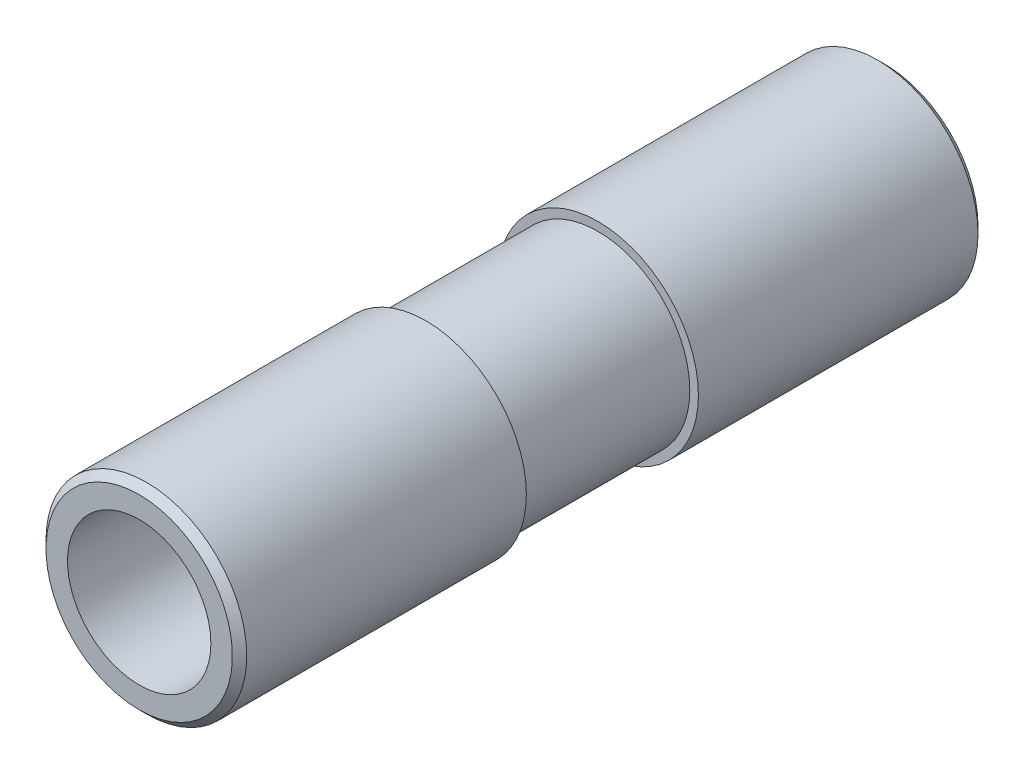
ISO-10303-21;
HEADER;
FILE_DESCRIPTION(('STEP AP214'),'2;1');
FILE_NAME('part.step','',(''),(''),'','','');
FILE_SCHEMA(('AUTOMOTIVE_DESIGN { 1 0 10303 214 1 1 1 1 }'));
ENDSEC;
DATA;
#1=APPLICATION_CONTEXT('core data for automotive mechanical design processes');
#2=APPLICATION_PROTOCOL_DEFINITION('international standard','automotive_design',2000,#1);
#3=PRODUCT_CONTEXT('',#1,'mechanical');
#4=PRODUCT('Part','Part','',(#3));
#5=PRODUCT_RELATED_PRODUCT_CATEGORY('part','',(#4));
#6=PRODUCT_DEFINITION_FORMATION('','',#4);
#7=PRODUCT_DEFINITION_CONTEXT('part definition',#1,'design');
#8=PRODUCT_DEFINITION('design','',#6,#7);
#9=PRODUCT_DEFINITION_SHAPE('','',#8);
#10=(LENGTH_UNIT() NAMED_UNIT(*) SI_UNIT(.MILLI.,.METRE.));
#11=(NAMED_UNIT(*) PLANE_ANGLE_UNIT() SI_UNIT($,.RADIAN.));
#12=(NAMED_UNIT(*) SI_UNIT($,.STERADIAN.) SOLID_ANGLE_UNIT());
#13=UNCERTAINTY_MEASURE_WITH_UNIT(LENGTH_MEASURE(1.E-05),#10,'distance_accuracy_value','');
#14=(GEOMETRIC_REPRESENTATION_CONTEXT(3) GLOBAL_UNCERTAINTY_ASSIGNED_CONTEXT((#13)) GLOBAL_UNIT_ASSIGNED_CONTEXT((#10,
#11,#12)) REPRESENTATION_CONTEXT('',''));
#15=CARTESIAN_POINT('',(0.,0.,0.));
#16=DIRECTION('',(0.,0.,1.));
#17=DIRECTION('',(1.,0.,0.));
#18=AXIS2_PLACEMENT_3D('',#15,#16,#17);
#19=CARTESIAN_POINT('',(0.,0.,7.75955985725057));
#20=DIRECTION('',(0.,0.,1.));
#21=DIRECTION('',(1.,0.,0.));
#22=AXIS2_PLACEMENT_3D('',#19,#20,#21);
#23=CYLINDRICAL_SURFACE('',#22,3.2);
#24=CARTESIAN_POINT('',(0.,0.,3.));
#25=DIRECTION('',(0.,0.,1.));
#26=DIRECTION('',(1.,0.,0.));
#27=AXIS2_PLACEMENT_3D('',#24,#25,#26);
#28=CIRCLE('',#27,3.2);
#29=CARTESIAN_POINT('',(3.2,0.,3.));
#30=VERTEX_POINT('',#29);
#31=EDGE_CURVE('E18',#30,#30,#28,.F.);
#32=ORIENTED_EDGE('',*,*,#31,.T.);
#33=EDGE_LOOP('',(#32));
#34=FACE_BOUND('',#33,.T.);
#35=CARTESIAN_POINT('',(0.,0.,-3.));
#36=DIRECTION('',(0.,0.,1.));
#37=DIRECTION('',(1.,0.,0.));
#38=AXIS2_PLACEMENT_3D('',#35,#36,#37);
#39=CIRCLE('',#38,3.2);
#40=CARTESIAN_POINT('',(3.2,0.,-3.));
#41=VERTEX_POINT('',#40);
#42=EDGE_CURVE('E44',#41,#41,#39,.T.);
#43=ORIENTED_EDGE('',*,*,#42,.T.);
#44=EDGE_LOOP('',(#43));
#45=FACE_BOUND('',#44,.T.);
#46=ADVANCED_FACE('F15',(#34,#45),#23,.T.);
#47=CARTESIAN_POINT('',(0.,3.5,3.));
#48=DIRECTION('',(0.,0.,1.));
#49=DIRECTION('',(1.,0.,0.));
#50=AXIS2_PLACEMENT_3D('',#47,#48,#49);
#51=PLANE('',#50);
#52=ORIENTED_EDGE('',*,*,#31,.F.);
#53=EDGE_LOOP('',(#52));
#54=FACE_BOUND('',#53,.T.);
#55=CARTESIAN_POINT('',(0.,0.,3.));
#56=DIRECTION('',(0.,0.,1.));
#57=DIRECTION('',(1.,0.,0.));
#58=AXIS2_PLACEMENT_3D('',#55,#56,#57);
#59=CIRCLE('',#58,3.5);
#60=CARTESIAN_POINT('',(3.5,0.,3.));
#61=VERTEX_POINT('',#60);
#62=EDGE_CURVE('E42',#61,#61,#59,.T.);
#63=ORIENTED_EDGE('',*,*,#62,.F.);
#64=EDGE_LOOP('',(#63));
#65=FACE_BOUND('',#64,.T.);
#66=ADVANCED_FACE('F52',(#54,#65),#51,.F.);
#67=CARTESIAN_POINT('',(0.,3.2,-3.));
#68=DIRECTION('',(0.,0.,-1.));
#69=DIRECTION('',(-1.,0.,0.));
#70=AXIS2_PLACEMENT_3D('',#67,#68,#69);
#71=PLANE('',#70);
#72=CARTESIAN_POINT('',(0.,0.,-3.));
#73=DIRECTION('',(0.,0.,1.));
#74=DIRECTION('',(1.,0.,0.));
#75=AXIS2_PLACEMENT_3D('',#72,#73,#74);
#76=CIRCLE('',#75,3.5);
#77=CARTESIAN_POINT('',(3.5,0.,-3.));
#78=VERTEX_POINT('',#77);
#79=EDGE_CURVE('E39',#78,#78,#76,.F.);
#80=ORIENTED_EDGE('',*,*,#79,.F.);
#81=EDGE_LOOP('',(#80));
#82=FACE_BOUND('',#81,.T.);
#83=ORIENTED_EDGE('',*,*,#42,.F.);
#84=EDGE_LOOP('',(#83));
#85=FACE_BOUND('',#84,.T.);
#86=ADVANCED_FACE('F55',(#82,#85),#71,.F.);
#87=CARTESIAN_POINT('',(0.,0.,7.75955985725057));
#88=DIRECTION('',(0.,0.,1.));
#89=DIRECTION('',(1.,0.,0.));
#90=AXIS2_PLACEMENT_3D('',#87,#88,#89);
#91=CYLINDRICAL_SURFACE('',#90,3.5);
#92=ORIENTED_EDGE('',*,*,#62,.T.);
#93=EDGE_LOOP('',(#92));
#94=FACE_BOUND('',#93,.T.);
#95=CARTESIAN_POINT('',(0.,0.,12.7499999999827));
#96=DIRECTION('',(0.,0.,-1.));
#97=DIRECTION('',(-1.,0.,0.));
#98=AXIS2_PLACEMENT_3D('',#95,#96,#97);
#99=CIRCLE('',#98,3.49999999997408);
#100=CARTESIAN_POINT('',(-3.49999999997408,0.,12.7499999999827));
#101=VERTEX_POINT('',#100);
#102=EDGE_CURVE('E30',#101,#101,#99,.F.);
#103=ORIENTED_EDGE('',*,*,#102,.F.);
#104=EDGE_LOOP('',(#103));
#105=FACE_BOUND('',#104,.T.);
#106=ADVANCED_FACE('F58',(#94,#105),#91,.T.);
#107=CARTESIAN_POINT('',(0.,0.,7.75955985725057));
#108=DIRECTION('',(0.,0.,1.));
#109=DIRECTION('',(1.,0.,0.));
#110=AXIS2_PLACEMENT_3D('',#107,#108,#109);
#111=CYLINDRICAL_SURFACE('',#110,3.5);
#112=CARTESIAN_POINT('',(0.,0.,-12.7499999999827));
#113=DIRECTION('',(0.,0.,1.));
#114=DIRECTION('',(1.,0.,0.));
#115=AXIS2_PLACEMENT_3D('',#112,#113,#114);
#116=CIRCLE('',#115,3.49999999991724);
#117=CARTESIAN_POINT('',(3.49999999991724,0.,-12.7499999999827));
#118=VERTEX_POINT('',#117);
#119=EDGE_CURVE('E38',#118,#118,#116,.F.);
#120=ORIENTED_EDGE('',*,*,#119,.F.);
#121=EDGE_LOOP('',(#120));
#122=FACE_BOUND('',#121,.T.);
#123=ORIENTED_EDGE('',*,*,#79,.T.);
#124=EDGE_LOOP('',(#123));
#125=FACE_BOUND('',#124,.T.);
#126=ADVANCED_FACE('F61',(#122,#125),#111,.T.);
#127=CARTESIAN_POINT('',(0.,0.,12.7499999999827));
#128=DIRECTION('',(0.,0.,-1.));
#129=DIRECTION('',(0.,1.,0.));
#130=AXIS2_PLACEMENT_3D('',#127,#128,#129);
#131=CONICAL_SURFACE('',#130,3.49999999997408,0.785398163397448);
#132=CARTESIAN_POINT('',(0.,0.,12.9999999999768));
#133=DIRECTION('',(0.,0.,-1.));
#134=DIRECTION('',(0.,1.,0.));
#135=AXIS2_PLACEMENT_3D('',#132,#133,#134);
#136=CIRCLE('',#135,3.24999999997999);
#137=CARTESIAN_POINT('',(0.,3.24999999997999,12.9999999999768));
#138=VERTEX_POINT('',#137);
#139=EDGE_CURVE('E35',#138,#138,#136,.T.);
#140=ORIENTED_EDGE('',*,*,#139,.T.);
#141=EDGE_LOOP('',(#140));
#142=FACE_BOUND('',#141,.T.);
#143=ORIENTED_EDGE('',*,*,#102,.T.);
#144=EDGE_LOOP('',(#143));
#145=FACE_BOUND('',#144,.T.);
#146=ADVANCED_FACE('F73',(#142,#145),#131,.T.);
#147=CARTESIAN_POINT('',(0.,0.,-12.7500000000396));
#148=DIRECTION('',(0.,0.,1.));
#149=DIRECTION('',(1.,0.,0.));
#150=AXIS2_PLACEMENT_3D('',#147,#148,#149);
#151=CONICAL_SURFACE('',#150,3.49999999980355,0.785398163283761);
#152=CARTESIAN_POINT('',(0.,0.,-12.99999999992));
#153=DIRECTION('',(0.,0.,1.));
#154=DIRECTION('',(1.,0.,0.));
#155=AXIS2_PLACEMENT_3D('',#152,#153,#154);
#156=CIRCLE('',#155,3.24999999997999);
#157=CARTESIAN_POINT('',(3.24999999997999,0.,-12.99999999992));
#158=VERTEX_POINT('',#157);
#159=EDGE_CURVE('E27',#158,#158,#156,.T.);
#160=ORIENTED_EDGE('',*,*,#159,.T.);
#161=EDGE_LOOP('',(#160));
#162=FACE_BOUND('',#161,.T.);
#163=ORIENTED_EDGE('',*,*,#119,.T.);
#164=EDGE_LOOP('',(#163));
#165=FACE_BOUND('',#164,.T.);
#166=ADVANCED_FACE('F69',(#162,#165),#151,.T.);
#167=CARTESIAN_POINT('',(0.,2.5,13.));
#168=DIRECTION('',(0.,0.,-1.));
#169=DIRECTION('',(-1.,0.,0.));
#170=AXIS2_PLACEMENT_3D('',#167,#168,#169);
#171=PLANE('',#170);
#172=CARTESIAN_POINT('',(0.,0.,13.));
#173=DIRECTION('',(0.,0.,1.));
#174=DIRECTION('',(1.,0.,0.));
#175=AXIS2_PLACEMENT_3D('',#172,#173,#174);
#176=CIRCLE('',#175,2.5);
#177=CARTESIAN_POINT('',(2.5,0.,13.));
#178=VERTEX_POINT('',#177);
#179=EDGE_CURVE('E22',#178,#178,#176,.F.);
#180=ORIENTED_EDGE('',*,*,#179,.T.);
#181=EDGE_LOOP('',(#180));
#182=FACE_BOUND('',#181,.T.);
#183=ORIENTED_EDGE('',*,*,#139,.F.);
#184=EDGE_LOOP('',(#183));
#185=FACE_BOUND('',#184,.T.);
#186=ADVANCED_FACE('F91',(#182,#185),#171,.F.);
#187=CARTESIAN_POINT('',(0.,3.5,-13.));
#188=DIRECTION('',(0.,0.,1.));
#189=DIRECTION('',(1.,0.,0.));
#190=AXIS2_PLACEMENT_3D('',#187,#188,#189);
#191=PLANE('',#190);
#192=CARTESIAN_POINT('',(0.,0.,-13.));
#193=DIRECTION('',(0.,0.,1.));
#194=DIRECTION('',(1.,0.,0.));
#195=AXIS2_PLACEMENT_3D('',#192,#193,#194);
#196=CIRCLE('',#195,2.5);
#197=CARTESIAN_POINT('',(2.5,0.,-13.));
#198=VERTEX_POINT('',#197);
#199=EDGE_CURVE('E10',#198,#198,#196,.T.);
#200=ORIENTED_EDGE('',*,*,#199,.T.);
#201=EDGE_LOOP('',(#200));
#202=FACE_BOUND('',#201,.T.);
#203=ORIENTED_EDGE('',*,*,#159,.F.);
#204=EDGE_LOOP('',(#203));
#205=FACE_BOUND('',#204,.T.);
#206=ADVANCED_FACE('F85',(#202,#205),#191,.F.);
#207=CARTESIAN_POINT('',(0.,0.,7.75955985725057));
#208=DIRECTION('',(0.,0.,1.));
#209=DIRECTION('',(1.,0.,0.));
#210=AXIS2_PLACEMENT_3D('',#207,#208,#209);
#211=CYLINDRICAL_SURFACE('',#210,2.5);
#212=ORIENTED_EDGE('',*,*,#179,.F.);
#213=EDGE_LOOP('',(#212));
#214=FACE_BOUND('',#213,.T.);
#215=ORIENTED_EDGE('',*,*,#199,.F.);
#216=EDGE_LOOP('',(#215));
#217=FACE_BOUND('',#216,.T.);
#218=ADVANCED_FACE('F83',(#214,#217),#211,.F.);
#219=CLOSED_SHELL('',(#46,#66,#86,#106,#126,#146,#166,#186,#206,#218));
#220=MANIFOLD_SOLID_BREP('B1',#219);
#221=ADVANCED_BREP_SHAPE_REPRESENTATION('',(#18,#220),#14);
#222=SHAPE_DEFINITION_REPRESENTATION(#9,#221);
ENDSEC;
END-ISO-10303-21;
